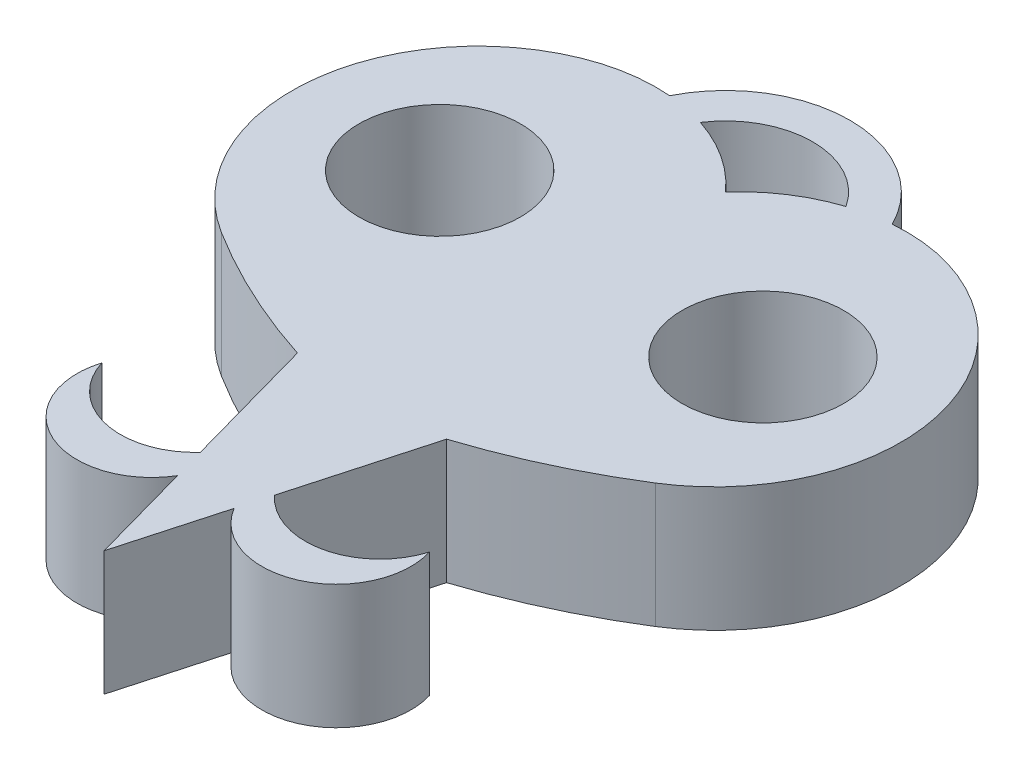
ISO-10303-21;
HEADER;
FILE_DESCRIPTION(('STEP AP214'),'2;1');
FILE_NAME('part.step','',(''),(''),'','','');
FILE_SCHEMA(('AUTOMOTIVE_DESIGN { 1 0 10303 214 1 1 1 1 }'));
ENDSEC;
DATA;
#1=APPLICATION_CONTEXT('core data for automotive mechanical design processes');
#2=APPLICATION_PROTOCOL_DEFINITION('international standard','automotive_design',2000,#1);
#3=PRODUCT_CONTEXT('',#1,'mechanical');
#4=PRODUCT('Part','Part','',(#3));
#5=PRODUCT_RELATED_PRODUCT_CATEGORY('part','',(#4));
#6=PRODUCT_DEFINITION_FORMATION('','',#4);
#7=PRODUCT_DEFINITION_CONTEXT('part definition',#1,'design');
#8=PRODUCT_DEFINITION('design','',#6,#7);
#9=PRODUCT_DEFINITION_SHAPE('','',#8);
#10=(LENGTH_UNIT() NAMED_UNIT(*) SI_UNIT(.MILLI.,.METRE.));
#11=(NAMED_UNIT(*) PLANE_ANGLE_UNIT() SI_UNIT($,.RADIAN.));
#12=(NAMED_UNIT(*) SI_UNIT($,.STERADIAN.) SOLID_ANGLE_UNIT());
#13=UNCERTAINTY_MEASURE_WITH_UNIT(LENGTH_MEASURE(1.E-05),#10,'distance_accuracy_value','');
#14=(GEOMETRIC_REPRESENTATION_CONTEXT(3) GLOBAL_UNCERTAINTY_ASSIGNED_CONTEXT((#13)) GLOBAL_UNIT_ASSIGNED_CONTEXT((#10,
#11,#12)) REPRESENTATION_CONTEXT('',''));
#15=CARTESIAN_POINT('',(0.,0.,0.));
#16=DIRECTION('',(0.,0.,1.));
#17=DIRECTION('',(1.,0.,0.));
#18=AXIS2_PLACEMENT_3D('',#15,#16,#17);
#19=CARTESIAN_POINT('',(-14.0872282582487,12.,-23.4771888934564));
#20=DIRECTION('',(0.,-1.,0.));
#21=DIRECTION('',(0.,0.,-1.));
#22=AXIS2_PLACEMENT_3D('',#19,#20,#21);
#23=CYLINDRICAL_SURFACE('',#22,18.9);
#24=CARTESIAN_POINT('',(-14.0872282582487,-2.,-23.4771888934564));
#25=DIRECTION('',(0.,1.,0.));
#26=DIRECTION('',(0.,0.,1.));
#27=AXIS2_PLACEMENT_3D('',#24,#25,#26);
#28=CIRCLE('',#27,18.9);
#29=CARTESIAN_POINT('',(0.,-2.,-36.0771888934564));
#30=VERTEX_POINT('',#29);
#31=CARTESIAN_POINT('',(-8.20370039289351,-2.,-41.4380936551211));
#32=VERTEX_POINT('',#31);
#33=EDGE_CURVE('E183',#30,#32,#28,.T.);
#34=ORIENTED_EDGE('',*,*,#33,.T.);
#35=DIRECTION('',(0.,-1.,0.));
#36=VECTOR('',#35,1.);
#37=CARTESIAN_POINT('',(-8.20370039289351,12.,-41.4380936551211));
#38=LINE('',#37,#36);
#39=CARTESIAN_POINT('',(-8.20370039289351,12.,-41.4380936551211));
#40=VERTEX_POINT('',#39);
#41=EDGE_CURVE('E11',#40,#32,#38,.T.);
#42=ORIENTED_EDGE('',*,*,#41,.F.);
#43=CARTESIAN_POINT('',(-14.0872282582487,12.,-23.4771888934564));
#44=DIRECTION('',(0.,1.,0.));
#45=DIRECTION('',(0.,0.,1.));
#46=AXIS2_PLACEMENT_3D('',#43,#44,#45);
#47=CIRCLE('',#46,18.9);
#48=CARTESIAN_POINT('',(0.,12.,-36.0771888934564));
#49=VERTEX_POINT('',#48);
#50=EDGE_CURVE('E176',#49,#40,#47,.T.);
#51=ORIENTED_EDGE('',*,*,#50,.F.);
#52=DIRECTION('',(0.,-1.,0.));
#53=VECTOR('',#52,1.);
#54=CARTESIAN_POINT('',(0.,12.,-36.0771888934564));
#55=LINE('',#54,#53);
#56=EDGE_CURVE('E57',#49,#30,#55,.T.);
#57=ORIENTED_EDGE('',*,*,#56,.T.);
#58=EDGE_LOOP('',(#34,#42,#51,#57));
#59=FACE_BOUND('',#58,.T.);
#60=ADVANCED_FACE('F38',(#59),#23,.T.);
#61=CARTESIAN_POINT('',(0.,12.,-36.0771888934564));
#62=DIRECTION('',(0.,-1.,0.));
#63=DIRECTION('',(0.,0.,-1.));
#64=AXIS2_PLACEMENT_3D('',#61,#62,#63);
#65=CYLINDRICAL_SURFACE('',#64,9.8);
#66=CARTESIAN_POINT('',(0.,-2.,-36.0771888934564));
#67=DIRECTION('',(0.,1.,0.));
#68=DIRECTION('',(0.,0.,1.));
#69=AXIS2_PLACEMENT_3D('',#66,#67,#68);
#70=CIRCLE('',#69,9.8);
#71=CARTESIAN_POINT('',(8.20370039289349,-2.,-41.4380936551211));
#72=VERTEX_POINT('',#71);
#73=EDGE_CURVE('E186',#32,#72,#70,.F.);
#74=ORIENTED_EDGE('',*,*,#73,.T.);
#75=DIRECTION('',(0.,-1.,0.));
#76=VECTOR('',#75,1.);
#77=CARTESIAN_POINT('',(8.20370039289349,12.,-41.4380936551211));
#78=LINE('',#77,#76);
#79=CARTESIAN_POINT('',(8.20370039289349,12.,-41.4380936551211));
#80=VERTEX_POINT('',#79);
#81=EDGE_CURVE('E48',#80,#72,#78,.T.);
#82=ORIENTED_EDGE('',*,*,#81,.F.);
#83=CARTESIAN_POINT('',(0.,12.,-36.0771888934564));
#84=DIRECTION('',(0.,1.,0.));
#85=DIRECTION('',(0.,0.,1.));
#86=AXIS2_PLACEMENT_3D('',#83,#84,#85);
#87=CIRCLE('',#86,9.8);
#88=EDGE_CURVE('E169',#40,#80,#87,.F.);
#89=ORIENTED_EDGE('',*,*,#88,.F.);
#90=ORIENTED_EDGE('',*,*,#41,.T.);
#91=EDGE_LOOP('',(#74,#82,#89,#90));
#92=FACE_BOUND('',#91,.T.);
#93=ADVANCED_FACE('F171',(#92),#65,.F.);
#94=CARTESIAN_POINT('',(-7.23450439594268,12.,7.93690496036144));
#95=DIRECTION('',(-0.963362899767975,0.,0.268201273954168));
#96=DIRECTION('',(0.268201273954168,0.,0.963362899767975));
#97=AXIS2_PLACEMENT_3D('',#94,#95,#96);
#98=PLANE('',#97);
#99=DIRECTION('',(-0.268201273954168,0.,-0.963362899767975));
#100=VECTOR('',#99,1.);
#101=CARTESIAN_POINT('',(-7.23450439594268,-2.,7.93690496036144));
#102=LINE('',#101,#100);
#103=CARTESIAN_POINT('',(-4.18138548338647,-2.,18.9035250870027));
#104=VERTEX_POINT('',#103);
#105=CARTESIAN_POINT('',(-8.4,-2.,3.75051461165877));
#106=VERTEX_POINT('',#105);
#107=EDGE_CURVE('E232',#104,#106,#102,.T.);
#108=ORIENTED_EDGE('',*,*,#107,.F.);
#109=DIRECTION('',(0.,-1.,0.));
#110=VECTOR('',#109,1.);
#111=CARTESIAN_POINT('',(-4.18138548338647,12.,18.9035250870027));
#112=LINE('',#111,#110);
#113=CARTESIAN_POINT('',(-4.18138548338647,12.,18.9035250870027));
#114=VERTEX_POINT('',#113);
#115=EDGE_CURVE('E42',#114,#104,#112,.T.);
#116=ORIENTED_EDGE('',*,*,#115,.F.);
#117=DIRECTION('',(-0.268201273954168,0.,-0.963362899767975));
#118=VECTOR('',#117,1.);
#119=CARTESIAN_POINT('',(-7.23450439594268,12.,7.93690496036144));
#120=LINE('',#119,#118);
#121=CARTESIAN_POINT('',(-8.4,12.,3.75051461165877));
#122=VERTEX_POINT('',#121);
#123=EDGE_CURVE('E271',#114,#122,#120,.T.);
#124=ORIENTED_EDGE('',*,*,#123,.T.);
#125=DIRECTION('',(0.,-1.,0.));
#126=VECTOR('',#125,1.);
#127=CARTESIAN_POINT('',(-8.4,12.,3.75051461165877));
#128=LINE('',#127,#126);
#129=EDGE_CURVE('E238',#122,#106,#128,.T.);
#130=ORIENTED_EDGE('',*,*,#129,.T.);
#131=EDGE_LOOP('',(#108,#116,#124,#130));
#132=FACE_BOUND('',#131,.T.);
#133=ADVANCED_FACE('F355',(#132),#98,.T.);
#134=CARTESIAN_POINT('',(-10.4147681982743,12.,13.2728111065436));
#135=DIRECTION('',(0.,-1.,0.));
#136=DIRECTION('',(0.,0.,-1.));
#137=AXIS2_PLACEMENT_3D('',#134,#135,#136);
#138=CYLINDRICAL_SURFACE('',#137,8.4);
#139=CARTESIAN_POINT('',(-10.4147681982743,-2.,13.2728111065436));
#140=DIRECTION('',(0.,1.,0.));
#141=DIRECTION('',(0.,0.,1.));
#142=AXIS2_PLACEMENT_3D('',#139,#140,#141);
#143=CIRCLE('',#142,8.4);
#144=CARTESIAN_POINT('',(-18.4495363965486,-2.,15.7228111065436));
#145=VERTEX_POINT('',#144);
#146=EDGE_CURVE('E229',#104,#145,#143,.F.);
#147=ORIENTED_EDGE('',*,*,#146,.T.);
#148=DIRECTION('',(0.,-1.,0.));
#149=VECTOR('',#148,1.);
#150=CARTESIAN_POINT('',(-18.4495363965486,12.,15.7228111065436));
#151=LINE('',#150,#149);
#152=CARTESIAN_POINT('',(-18.4495363965486,12.,15.7228111065436));
#153=VERTEX_POINT('',#152);
#154=EDGE_CURVE('E293',#153,#145,#151,.T.);
#155=ORIENTED_EDGE('',*,*,#154,.F.);
#156=CARTESIAN_POINT('',(-10.4147681982743,12.,13.2728111065436));
#157=DIRECTION('',(0.,1.,0.));
#158=DIRECTION('',(0.,0.,1.));
#159=AXIS2_PLACEMENT_3D('',#156,#157,#158);
#160=CIRCLE('',#159,8.4);
#161=EDGE_CURVE('E269',#114,#153,#160,.F.);
#162=ORIENTED_EDGE('',*,*,#161,.F.);
#163=ORIENTED_EDGE('',*,*,#115,.T.);
#164=EDGE_LOOP('',(#147,#155,#162,#163));
#165=FACE_BOUND('',#164,.T.);
#166=ADVANCED_FACE('F40',(#165),#138,.F.);
#167=CARTESIAN_POINT('',(-10.4147681982743,12.,18.1728111065435));
#168=DIRECTION('',(0.,-1.,0.));
#169=DIRECTION('',(0.,0.,-1.));
#170=AXIS2_PLACEMENT_3D('',#167,#168,#169);
#171=CYLINDRICAL_SURFACE('',#170,8.4);
#172=CARTESIAN_POINT('',(-10.4147681982743,-2.,18.1728111065435));
#173=DIRECTION('',(0.,1.,0.));
#174=DIRECTION('',(0.,0.,1.));
#175=AXIS2_PLACEMENT_3D('',#172,#173,#174);
#176=CIRCLE('',#175,8.4);
#177=CARTESIAN_POINT('',(-3.19123854098293,-2.,22.460073553634));
#178=VERTEX_POINT('',#177);
#179=EDGE_CURVE('E226',#178,#145,#176,.F.);
#180=ORIENTED_EDGE('',*,*,#179,.F.);
#181=DIRECTION('',(0.,-1.,0.));
#182=VECTOR('',#181,1.);
#183=CARTESIAN_POINT('',(-3.19123854098293,12.,22.460073553634));
#184=LINE('',#183,#182);
#185=CARTESIAN_POINT('',(-3.19123854098293,12.,22.460073553634));
#186=VERTEX_POINT('',#185);
#187=EDGE_CURVE('E283',#186,#178,#184,.T.);
#188=ORIENTED_EDGE('',*,*,#187,.F.);
#189=CARTESIAN_POINT('',(-10.4147681982743,12.,18.1728111065435));
#190=DIRECTION('',(0.,1.,0.));
#191=DIRECTION('',(0.,0.,1.));
#192=AXIS2_PLACEMENT_3D('',#189,#190,#191);
#193=CIRCLE('',#192,8.4);
#194=EDGE_CURVE('E266',#186,#153,#193,.F.);
#195=ORIENTED_EDGE('',*,*,#194,.T.);
#196=ORIENTED_EDGE('',*,*,#154,.T.);
#197=EDGE_LOOP('',(#180,#188,#195,#196));
#198=FACE_BOUND('',#197,.T.);
#199=ADVANCED_FACE('F292',(#198),#171,.T.);
#200=CARTESIAN_POINT('',(0.,-2.,33.9228111065436));
#201=VERTEX_POINT('',#200);
#202=EDGE_CURVE('E225',#201,#178,#102,.T.);
#203=ORIENTED_EDGE('',*,*,#202,.F.);
#204=DIRECTION('',(0.,-1.,0.));
#205=VECTOR('',#204,1.);
#206=CARTESIAN_POINT('',(0.,12.,33.9228111065436));
#207=LINE('',#206,#205);
#208=CARTESIAN_POINT('',(0.,12.,33.9228111065436));
#209=VERTEX_POINT('',#208);
#210=EDGE_CURVE('E285',#209,#201,#207,.T.);
#211=ORIENTED_EDGE('',*,*,#210,.F.);
#212=EDGE_CURVE('E265',#209,#186,#120,.T.);
#213=ORIENTED_EDGE('',*,*,#212,.T.);
#214=ORIENTED_EDGE('',*,*,#187,.T.);
#215=EDGE_LOOP('',(#203,#211,#213,#214));
#216=FACE_BOUND('',#215,.T.);
#217=ADVANCED_FACE('F282',(#216),#98,.T.);
#218=CARTESIAN_POINT('',(7.23450439594267,12.,7.93690496036144));
#219=DIRECTION('',(-0.963362899767975,0.,-0.268201273954168));
#220=DIRECTION('',(-0.268201273954168,0.,0.963362899767975));
#221=AXIS2_PLACEMENT_3D('',#218,#219,#220);
#222=PLANE('',#221);
#223=DIRECTION('',(0.268201273954168,0.,-0.963362899767975));
#224=VECTOR('',#223,1.);
#225=CARTESIAN_POINT('',(7.23450439594267,-2.,7.93690496036144));
#226=LINE('',#225,#224);
#227=CARTESIAN_POINT('',(3.19123854098292,-2.,22.460073553634));
#228=VERTEX_POINT('',#227);
#229=EDGE_CURVE('E223',#201,#228,#226,.T.);
#230=ORIENTED_EDGE('',*,*,#229,.T.);
#231=DIRECTION('',(0.,-1.,0.));
#232=VECTOR('',#231,1.);
#233=CARTESIAN_POINT('',(3.19123854098292,12.,22.460073553634));
#234=LINE('',#233,#232);
#235=CARTESIAN_POINT('',(3.19123854098292,12.,22.460073553634));
#236=VERTEX_POINT('',#235);
#237=EDGE_CURVE('E296',#236,#228,#234,.T.);
#238=ORIENTED_EDGE('',*,*,#237,.F.);
#239=DIRECTION('',(0.268201273954168,0.,-0.963362899767975));
#240=VECTOR('',#239,1.);
#241=CARTESIAN_POINT('',(7.23450439594267,12.,7.93690496036144));
#242=LINE('',#241,#240);
#243=EDGE_CURVE('E263',#209,#236,#242,.T.);
#244=ORIENTED_EDGE('',*,*,#243,.F.);
#245=ORIENTED_EDGE('',*,*,#210,.T.);
#246=EDGE_LOOP('',(#230,#238,#244,#245));
#247=FACE_BOUND('',#246,.T.);
#248=ADVANCED_FACE('F380',(#247),#222,.F.);
#249=CARTESIAN_POINT('',(10.4147681982743,12.,18.1728111065436));
#250=DIRECTION('',(0.,-1.,0.));
#251=DIRECTION('',(0.,0.,-1.));
#252=AXIS2_PLACEMENT_3D('',#249,#250,#251);
#253=CYLINDRICAL_SURFACE('',#252,8.4);
#254=CARTESIAN_POINT('',(10.4147681982743,-2.,18.1728111065436));
#255=DIRECTION('',(0.,1.,0.));
#256=DIRECTION('',(0.,0.,1.));
#257=AXIS2_PLACEMENT_3D('',#254,#255,#256);
#258=CIRCLE('',#257,8.4);
#259=CARTESIAN_POINT('',(18.4495363965486,-2.,15.7228111065436));
#260=VERTEX_POINT('',#259);
#261=EDGE_CURVE('E220',#228,#260,#258,.T.);
#262=ORIENTED_EDGE('',*,*,#261,.T.);
#263=DIRECTION('',(0.,-1.,0.));
#264=VECTOR('',#263,1.);
#265=CARTESIAN_POINT('',(18.4495363965486,12.,15.7228111065436));
#266=LINE('',#265,#264);
#267=CARTESIAN_POINT('',(18.4495363965486,12.,15.7228111065436));
#268=VERTEX_POINT('',#267);
#269=EDGE_CURVE('E301',#268,#260,#266,.T.);
#270=ORIENTED_EDGE('',*,*,#269,.F.);
#271=CARTESIAN_POINT('',(10.4147681982743,12.,18.1728111065436));
#272=DIRECTION('',(0.,1.,0.));
#273=DIRECTION('',(0.,0.,1.));
#274=AXIS2_PLACEMENT_3D('',#271,#272,#273);
#275=CIRCLE('',#274,8.4);
#276=EDGE_CURVE('E261',#236,#268,#275,.T.);
#277=ORIENTED_EDGE('',*,*,#276,.F.);
#278=ORIENTED_EDGE('',*,*,#237,.T.);
#279=EDGE_LOOP('',(#262,#270,#277,#278));
#280=FACE_BOUND('',#279,.T.);
#281=ADVANCED_FACE('F383',(#280),#253,.T.);
#282=CARTESIAN_POINT('',(10.4147681982743,12.,13.2728111065436));
#283=DIRECTION('',(0.,-1.,0.));
#284=DIRECTION('',(0.,0.,-1.));
#285=AXIS2_PLACEMENT_3D('',#282,#283,#284);
#286=CYLINDRICAL_SURFACE('',#285,8.4);
#287=CARTESIAN_POINT('',(10.4147681982743,-2.,13.2728111065436));
#288=DIRECTION('',(0.,1.,0.));
#289=DIRECTION('',(0.,0.,1.));
#290=AXIS2_PLACEMENT_3D('',#287,#288,#289);
#291=CIRCLE('',#290,8.4);
#292=CARTESIAN_POINT('',(4.18138548338646,-2.,18.9035250870027));
#293=VERTEX_POINT('',#292);
#294=EDGE_CURVE('E217',#293,#260,#291,.T.);
#295=ORIENTED_EDGE('',*,*,#294,.F.);
#296=DIRECTION('',(0.,-1.,0.));
#297=VECTOR('',#296,1.);
#298=CARTESIAN_POINT('',(4.18138548338646,12.,18.9035250870027));
#299=LINE('',#298,#297);
#300=CARTESIAN_POINT('',(4.18138548338646,12.,18.9035250870027));
#301=VERTEX_POINT('',#300);
#302=EDGE_CURVE('E303',#301,#293,#299,.T.);
#303=ORIENTED_EDGE('',*,*,#302,.F.);
#304=CARTESIAN_POINT('',(10.4147681982743,12.,13.2728111065436));
#305=DIRECTION('',(0.,1.,0.));
#306=DIRECTION('',(0.,0.,1.));
#307=AXIS2_PLACEMENT_3D('',#304,#305,#306);
#308=CIRCLE('',#307,8.4);
#309=EDGE_CURVE('E258',#301,#268,#308,.T.);
#310=ORIENTED_EDGE('',*,*,#309,.T.);
#311=ORIENTED_EDGE('',*,*,#269,.T.);
#312=EDGE_LOOP('',(#295,#303,#310,#311));
#313=FACE_BOUND('',#312,.T.);
#314=ADVANCED_FACE('F378',(#313),#286,.F.);
#315=CARTESIAN_POINT('',(8.4,-2.,3.75051461165877));
#316=VERTEX_POINT('',#315);
#317=EDGE_CURVE('E216',#293,#316,#226,.T.);
#318=ORIENTED_EDGE('',*,*,#317,.T.);
#319=DIRECTION('',(0.,-1.,0.));
#320=VECTOR('',#319,1.);
#321=CARTESIAN_POINT('',(8.4,12.,3.75051461165877));
#322=LINE('',#321,#320);
#323=CARTESIAN_POINT('',(8.4,12.,3.75051461165877));
#324=VERTEX_POINT('',#323);
#325=EDGE_CURVE('E305',#324,#316,#322,.T.);
#326=ORIENTED_EDGE('',*,*,#325,.F.);
#327=EDGE_CURVE('E257',#301,#324,#242,.T.);
#328=ORIENTED_EDGE('',*,*,#327,.F.);
#329=ORIENTED_EDGE('',*,*,#302,.T.);
#330=EDGE_LOOP('',(#318,#326,#328,#329));
#331=FACE_BOUND('',#330,.T.);
#332=ADVANCED_FACE('F374',(#331),#222,.F.);
#333=CARTESIAN_POINT('',(-13.8189820857669,12.,-64.8404967168846));
#334=DIRECTION('',(0.,-1.,0.));
#335=DIRECTION('',(0.,0.,-1.));
#336=AXIS2_PLACEMENT_3D('',#333,#334,#335);
#337=CYLINDRICAL_SURFACE('',#336,72.1);
#338=CARTESIAN_POINT('',(-13.8189820857669,-2.,-64.8404967168846));
#339=DIRECTION('',(0.,1.,0.));
#340=DIRECTION('',(0.,0.,1.));
#341=AXIS2_PLACEMENT_3D('',#338,#339,#340);
#342=CIRCLE('',#341,72.1);
#343=CARTESIAN_POINT('',(24.4447871585343,-2.,-3.73162695791373));
#344=VERTEX_POINT('',#343);
#345=EDGE_CURVE('E213',#316,#344,#342,.T.);
#346=ORIENTED_EDGE('',*,*,#345,.T.);
#347=DIRECTION('',(0.,-1.,0.));
#348=VECTOR('',#347,1.);
#349=CARTESIAN_POINT('',(24.4447871585343,12.,-3.73162695791373));
#350=LINE('',#349,#348);
#351=CARTESIAN_POINT('',(24.4447871585343,12.,-3.73162695791373));
#352=VERTEX_POINT('',#351);
#353=EDGE_CURVE('E308',#352,#344,#350,.T.);
#354=ORIENTED_EDGE('',*,*,#353,.F.);
#355=CARTESIAN_POINT('',(-13.8189820857669,12.,-64.8404967168846));
#356=DIRECTION('',(0.,1.,0.));
#357=DIRECTION('',(0.,0.,1.));
#358=AXIS2_PLACEMENT_3D('',#355,#356,#357);
#359=CIRCLE('',#358,72.1);
#360=EDGE_CURVE('E255',#324,#352,#359,.T.);
#361=ORIENTED_EDGE('',*,*,#360,.F.);
#362=ORIENTED_EDGE('',*,*,#325,.T.);
#363=EDGE_LOOP('',(#346,#354,#361,#362));
#364=FACE_BOUND('',#363,.T.);
#365=ADVANCED_FACE('F370',(#364),#337,.T.);
#366=CARTESIAN_POINT('',(13.3,12.,-21.5303268877111));
#367=DIRECTION('',(0.,-1.,0.));
#368=DIRECTION('',(0.,0.,-1.));
#369=AXIS2_PLACEMENT_3D('',#366,#367,#368);
#370=CYLINDRICAL_SURFACE('',#369,21.);
#371=CARTESIAN_POINT('',(13.3,-2.,-21.5303268877111));
#372=DIRECTION('',(0.,1.,0.));
#373=DIRECTION('',(0.,0.,1.));
#374=AXIS2_PLACEMENT_3D('',#371,#372,#373);
#375=CIRCLE('',#374,21.);
#376=CARTESIAN_POINT('',(21.1722825824867,-2.,-40.9989469451645));
#377=VERTEX_POINT('',#376);
#378=EDGE_CURVE('E208',#377,#344,#375,.F.);
#379=ORIENTED_EDGE('',*,*,#378,.F.);
#380=DIRECTION('',(0.,-1.,0.));
#381=VECTOR('',#380,1.);
#382=CARTESIAN_POINT('',(21.1722825824867,12.,-40.9989469451645));
#383=LINE('',#382,#381);
#384=CARTESIAN_POINT('',(21.1722825824867,12.,-40.9989469451645));
#385=VERTEX_POINT('',#384);
#386=EDGE_CURVE('E310',#385,#377,#383,.T.);
#387=ORIENTED_EDGE('',*,*,#386,.F.);
#388=CARTESIAN_POINT('',(13.3,12.,-21.5303268877111));
#389=DIRECTION('',(0.,1.,0.));
#390=DIRECTION('',(0.,0.,1.));
#391=AXIS2_PLACEMENT_3D('',#388,#389,#390);
#392=CIRCLE('',#391,21.);
#393=EDGE_CURVE('E252',#385,#352,#392,.F.);
#394=ORIENTED_EDGE('',*,*,#393,.T.);
#395=ORIENTED_EDGE('',*,*,#353,.T.);
#396=EDGE_LOOP('',(#379,#387,#394,#395));
#397=FACE_BOUND('',#396,.T.);
#398=ADVANCED_FACE('F347',(#397),#370,.T.);
#399=CARTESIAN_POINT('',(14.0872282582487,12.,-23.4771888934564));
#400=DIRECTION('',(0.,-1.,0.));
#401=DIRECTION('',(0.,0.,-1.));
#402=AXIS2_PLACEMENT_3D('',#399,#400,#401);
#403=CYLINDRICAL_SURFACE('',#402,18.9);
#404=CARTESIAN_POINT('',(14.0872282582487,-2.,-23.4771888934564));
#405=DIRECTION('',(0.,1.,0.));
#406=DIRECTION('',(0.,0.,1.));
#407=AXIS2_PLACEMENT_3D('',#404,#405,#406);
#408=CIRCLE('',#407,18.9);
#409=CARTESIAN_POINT('',(12.534394373742,-2.,-42.3132900539176));
#410=VERTEX_POINT('',#409);
#411=EDGE_CURVE('E204',#410,#377,#408,.F.);
#412=ORIENTED_EDGE('',*,*,#411,.F.);
#413=DIRECTION('',(0.,-1.,0.));
#414=VECTOR('',#413,1.);
#415=CARTESIAN_POINT('',(12.534394373742,12.,-42.3132900539176));
#416=LINE('',#415,#414);
#417=CARTESIAN_POINT('',(12.534394373742,12.,-42.3132900539176));
#418=VERTEX_POINT('',#417);
#419=EDGE_CURVE('E312',#418,#410,#416,.T.);
#420=ORIENTED_EDGE('',*,*,#419,.F.);
#421=CARTESIAN_POINT('',(14.0872282582487,12.,-23.4771888934564));
#422=DIRECTION('',(0.,1.,0.));
#423=DIRECTION('',(0.,0.,1.));
#424=AXIS2_PLACEMENT_3D('',#421,#422,#423);
#425=CIRCLE('',#424,18.9);
#426=EDGE_CURVE('E249',#418,#385,#425,.F.);
#427=ORIENTED_EDGE('',*,*,#426,.T.);
#428=ORIENTED_EDGE('',*,*,#386,.T.);
#429=EDGE_LOOP('',(#412,#420,#427,#428));
#430=FACE_BOUND('',#429,.T.);
#431=ADVANCED_FACE('F333',(#430),#403,.T.);
#432=CARTESIAN_POINT('',(0.,12.,-36.0771888934564));
#433=DIRECTION('',(0.,-1.,0.));
#434=DIRECTION('',(0.,0.,-1.));
#435=AXIS2_PLACEMENT_3D('',#432,#433,#434);
#436=CYLINDRICAL_SURFACE('',#435,14.);
#437=CARTESIAN_POINT('',(0.,-2.,-36.0771888934564));
#438=DIRECTION('',(0.,1.,0.));
#439=DIRECTION('',(0.,0.,1.));
#440=AXIS2_PLACEMENT_3D('',#437,#438,#439);
#441=CIRCLE('',#440,14.);
#442=CARTESIAN_POINT('',(-12.534394373742,-2.,-42.3132900539176));
#443=VERTEX_POINT('',#442);
#444=EDGE_CURVE('E197',#443,#410,#441,.F.);
#445=ORIENTED_EDGE('',*,*,#444,.F.);
#446=DIRECTION('',(0.,-1.,0.));
#447=VECTOR('',#446,1.);
#448=CARTESIAN_POINT('',(-12.534394373742,12.,-42.3132900539176));
#449=LINE('',#448,#447);
#450=CARTESIAN_POINT('',(-12.534394373742,12.,-42.3132900539176));
#451=VERTEX_POINT('',#450);
#452=EDGE_CURVE('E314',#451,#443,#449,.T.);
#453=ORIENTED_EDGE('',*,*,#452,.F.);
#454=CARTESIAN_POINT('',(0.,12.,-36.0771888934564));
#455=DIRECTION('',(0.,1.,0.));
#456=DIRECTION('',(0.,0.,1.));
#457=AXIS2_PLACEMENT_3D('',#454,#455,#456);
#458=CIRCLE('',#457,14.);
#459=EDGE_CURVE('E246',#451,#418,#458,.F.);
#460=ORIENTED_EDGE('',*,*,#459,.T.);
#461=ORIENTED_EDGE('',*,*,#419,.T.);
#462=EDGE_LOOP('',(#445,#453,#460,#461));
#463=FACE_BOUND('',#462,.T.);
#464=ADVANCED_FACE('F346',(#463),#436,.T.);
#465=CARTESIAN_POINT('',(-21.1722825824867,-2.,-40.9989469451645));
#466=VERTEX_POINT('',#465);
#467=EDGE_CURVE('E189',#443,#466,#28,.T.);
#468=ORIENTED_EDGE('',*,*,#467,.T.);
#469=DIRECTION('',(0.,-1.,0.));
#470=VECTOR('',#469,1.);
#471=CARTESIAN_POINT('',(-21.1722825824867,12.,-40.9989469451645));
#472=LINE('',#471,#470);
#473=CARTESIAN_POINT('',(-21.1722825824867,12.,-40.9989469451645));
#474=VERTEX_POINT('',#473);
#475=EDGE_CURVE('E316',#474,#466,#472,.T.);
#476=ORIENTED_EDGE('',*,*,#475,.F.);
#477=EDGE_CURVE('E182',#451,#474,#47,.T.);
#478=ORIENTED_EDGE('',*,*,#477,.F.);
#479=ORIENTED_EDGE('',*,*,#452,.T.);
#480=EDGE_LOOP('',(#468,#476,#478,#479));
#481=FACE_BOUND('',#480,.T.);
#482=ADVANCED_FACE('F351',(#481),#23,.T.);
#483=CARTESIAN_POINT('',(-13.3,12.,-21.5303268877111));
#484=DIRECTION('',(0.,-1.,0.));
#485=DIRECTION('',(0.,0.,-1.));
#486=AXIS2_PLACEMENT_3D('',#483,#484,#485);
#487=CYLINDRICAL_SURFACE('',#486,21.);
#488=CARTESIAN_POINT('',(-13.3,-2.,-21.5303268877111));
#489=DIRECTION('',(0.,1.,0.));
#490=DIRECTION('',(0.,0.,1.));
#491=AXIS2_PLACEMENT_3D('',#488,#489,#490);
#492=CIRCLE('',#491,21.);
#493=CARTESIAN_POINT('',(-24.4447871585343,-2.,-3.73162695791372));
#494=VERTEX_POINT('',#493);
#495=EDGE_CURVE('E193',#466,#494,#492,.T.);
#496=ORIENTED_EDGE('',*,*,#495,.T.);
#497=DIRECTION('',(0.,-1.,0.));
#498=VECTOR('',#497,1.);
#499=CARTESIAN_POINT('',(-24.4447871585343,12.,-3.73162695791372));
#500=LINE('',#499,#498);
#501=CARTESIAN_POINT('',(-24.4447871585343,12.,-3.73162695791372));
#502=VERTEX_POINT('',#501);
#503=EDGE_CURVE('E318',#502,#494,#500,.T.);
#504=ORIENTED_EDGE('',*,*,#503,.F.);
#505=CARTESIAN_POINT('',(-13.3,12.,-21.5303268877111));
#506=DIRECTION('',(0.,1.,0.));
#507=DIRECTION('',(0.,0.,1.));
#508=AXIS2_PLACEMENT_3D('',#505,#506,#507);
#509=CIRCLE('',#508,21.);
#510=EDGE_CURVE('E244',#474,#502,#509,.T.);
#511=ORIENTED_EDGE('',*,*,#510,.F.);
#512=ORIENTED_EDGE('',*,*,#475,.T.);
#513=EDGE_LOOP('',(#496,#504,#511,#512));
#514=FACE_BOUND('',#513,.T.);
#515=ADVANCED_FACE('F341',(#514),#487,.T.);
#516=CARTESIAN_POINT('',(-18.2,12.,-22.0771888934564));
#517=DIRECTION('',(0.,-1.,0.));
#518=DIRECTION('',(0.,0.,-1.));
#519=AXIS2_PLACEMENT_3D('',#516,#517,#518);
#520=CYLINDRICAL_SURFACE('',#519,9.1);
#521=CARTESIAN_POINT('',(-18.2,12.,-22.0771888934564));
#522=DIRECTION('',(0.,1.,0.));
#523=DIRECTION('',(0.,0.,1.));
#524=AXIS2_PLACEMENT_3D('',#521,#522,#523);
#525=CIRCLE('',#524,9.1);
#526=CARTESIAN_POINT('',(-18.2,12.,-12.9771888934564));
#527=VERTEX_POINT('',#526);
#528=EDGE_CURVE('E239',#527,#527,#525,.F.);
#529=ORIENTED_EDGE('',*,*,#528,.F.);
#530=EDGE_LOOP('',(#529));
#531=FACE_BOUND('',#530,.T.);
#532=CARTESIAN_POINT('',(-18.2,-2.,-22.0771888934564));
#533=DIRECTION('',(0.,1.,0.));
#534=DIRECTION('',(0.,0.,1.));
#535=AXIS2_PLACEMENT_3D('',#532,#533,#534);
#536=CIRCLE('',#535,9.1);
#537=CARTESIAN_POINT('',(-18.2,-2.,-12.9771888934564));
#538=VERTEX_POINT('',#537);
#539=EDGE_CURVE('E276',#538,#538,#536,.F.);
#540=ORIENTED_EDGE('',*,*,#539,.T.);
#541=EDGE_LOOP('',(#540));
#542=FACE_BOUND('',#541,.T.);
#543=ADVANCED_FACE('F331',(#531,#542),#520,.F.);
#544=EDGE_CURVE('E190',#30,#72,#408,.F.);
#545=ORIENTED_EDGE('',*,*,#544,.F.);
#546=ORIENTED_EDGE('',*,*,#56,.F.);
#547=EDGE_CURVE('E175',#49,#80,#425,.F.);
#548=ORIENTED_EDGE('',*,*,#547,.T.);
#549=ORIENTED_EDGE('',*,*,#81,.T.);
#550=EDGE_LOOP('',(#545,#546,#548,#549));
#551=FACE_BOUND('',#550,.T.);
#552=ADVANCED_FACE('F328',(#551),#403,.T.);
#553=CARTESIAN_POINT('',(13.8189820857669,12.,-64.8404967168846));
#554=DIRECTION('',(0.,-1.,0.));
#555=DIRECTION('',(0.,0.,-1.));
#556=AXIS2_PLACEMENT_3D('',#553,#554,#555);
#557=CYLINDRICAL_SURFACE('',#556,72.1);
#558=CARTESIAN_POINT('',(13.8189820857669,-2.,-64.8404967168846));
#559=DIRECTION('',(0.,1.,0.));
#560=DIRECTION('',(0.,0.,1.));
#561=AXIS2_PLACEMENT_3D('',#558,#559,#560);
#562=CIRCLE('',#561,72.1);
#563=EDGE_CURVE('E187',#106,#494,#562,.F.);
#564=ORIENTED_EDGE('',*,*,#563,.F.);
#565=ORIENTED_EDGE('',*,*,#129,.F.);
#566=CARTESIAN_POINT('',(13.8189820857669,12.,-64.8404967168846));
#567=DIRECTION('',(0.,1.,0.));
#568=DIRECTION('',(0.,0.,1.));
#569=AXIS2_PLACEMENT_3D('',#566,#567,#568);
#570=CIRCLE('',#569,72.1);
#571=EDGE_CURVE('E180',#122,#502,#570,.F.);
#572=ORIENTED_EDGE('',*,*,#571,.T.);
#573=ORIENTED_EDGE('',*,*,#503,.T.);
#574=EDGE_LOOP('',(#564,#565,#572,#573));
#575=FACE_BOUND('',#574,.T.);
#576=ADVANCED_FACE('F330',(#575),#557,.T.);
#577=CARTESIAN_POINT('',(18.2,12.,-22.0771888934564));
#578=DIRECTION('',(0.,-1.,0.));
#579=DIRECTION('',(0.,0.,-1.));
#580=AXIS2_PLACEMENT_3D('',#577,#578,#579);
#581=CYLINDRICAL_SURFACE('',#580,9.1);
#582=CARTESIAN_POINT('',(18.2,12.,-22.0771888934564));
#583=DIRECTION('',(0.,1.,0.));
#584=DIRECTION('',(0.,0.,1.));
#585=AXIS2_PLACEMENT_3D('',#582,#583,#584);
#586=CIRCLE('',#585,9.1);
#587=CARTESIAN_POINT('',(18.2,12.,-12.9771888934564));
#588=VERTEX_POINT('',#587);
#589=EDGE_CURVE('E235',#588,#588,#586,.T.);
#590=ORIENTED_EDGE('',*,*,#589,.T.);
#591=EDGE_LOOP('',(#590));
#592=FACE_BOUND('',#591,.T.);
#593=CARTESIAN_POINT('',(18.2,-2.,-22.0771888934564));
#594=DIRECTION('',(0.,1.,0.));
#595=DIRECTION('',(0.,0.,1.));
#596=AXIS2_PLACEMENT_3D('',#593,#594,#595);
#597=CIRCLE('',#596,9.1);
#598=CARTESIAN_POINT('',(18.2,-2.,-12.9771888934564));
#599=VERTEX_POINT('',#598);
#600=EDGE_CURVE('E272',#599,#599,#597,.T.);
#601=ORIENTED_EDGE('',*,*,#600,.F.);
#602=EDGE_LOOP('',(#601));
#603=FACE_BOUND('',#602,.T.);
#604=ADVANCED_FACE('F338',(#592,#603),#581,.F.);
#605=CARTESIAN_POINT('',(0.,12.,5.92281110654355));
#606=DIRECTION('',(0.,1.,0.));
#607=DIRECTION('',(0.,0.,1.));
#608=AXIS2_PLACEMENT_3D('',#605,#606,#607);
#609=PLANE('',#608);
#610=ORIENTED_EDGE('',*,*,#123,.F.);
#611=ORIENTED_EDGE('',*,*,#161,.T.);
#612=ORIENTED_EDGE('',*,*,#194,.F.);
#613=ORIENTED_EDGE('',*,*,#212,.F.);
#614=ORIENTED_EDGE('',*,*,#243,.T.);
#615=ORIENTED_EDGE('',*,*,#276,.T.);
#616=ORIENTED_EDGE('',*,*,#309,.F.);
#617=ORIENTED_EDGE('',*,*,#327,.T.);
#618=ORIENTED_EDGE('',*,*,#360,.T.);
#619=ORIENTED_EDGE('',*,*,#393,.F.);
#620=ORIENTED_EDGE('',*,*,#426,.F.);
#621=ORIENTED_EDGE('',*,*,#459,.F.);
#622=ORIENTED_EDGE('',*,*,#477,.T.);
#623=ORIENTED_EDGE('',*,*,#510,.T.);
#624=ORIENTED_EDGE('',*,*,#571,.F.);
#625=EDGE_LOOP('',(#610,#611,#612,#613,#614,#615,#616,#617,#618,#619,#620,#621,#622,#623,#624));
#626=FACE_BOUND('',#625,.T.);
#627=ORIENTED_EDGE('',*,*,#50,.T.);
#628=ORIENTED_EDGE('',*,*,#88,.T.);
#629=ORIENTED_EDGE('',*,*,#547,.F.);
#630=EDGE_LOOP('',(#627,#628,#629));
#631=FACE_BOUND('',#630,.T.);
#632=ORIENTED_EDGE('',*,*,#528,.T.);
#633=EDGE_LOOP('',(#632));
#634=FACE_BOUND('',#633,.T.);
#635=ORIENTED_EDGE('',*,*,#589,.F.);
#636=EDGE_LOOP('',(#635));
#637=FACE_BOUND('',#636,.T.);
#638=ADVANCED_FACE('F178',(#626,#631,#634,#637),#609,.T.);
#639=CARTESIAN_POINT('',(0.,-2.,5.92281110654355));
#640=DIRECTION('',(0.,1.,0.));
#641=DIRECTION('',(0.,0.,1.));
#642=AXIS2_PLACEMENT_3D('',#639,#640,#641);
#643=PLANE('',#642);
#644=ORIENTED_EDGE('',*,*,#107,.T.);
#645=ORIENTED_EDGE('',*,*,#563,.T.);
#646=ORIENTED_EDGE('',*,*,#495,.F.);
#647=ORIENTED_EDGE('',*,*,#467,.F.);
#648=ORIENTED_EDGE('',*,*,#444,.T.);
#649=ORIENTED_EDGE('',*,*,#411,.T.);
#650=ORIENTED_EDGE('',*,*,#378,.T.);
#651=ORIENTED_EDGE('',*,*,#345,.F.);
#652=ORIENTED_EDGE('',*,*,#317,.F.);
#653=ORIENTED_EDGE('',*,*,#294,.T.);
#654=ORIENTED_EDGE('',*,*,#261,.F.);
#655=ORIENTED_EDGE('',*,*,#229,.F.);
#656=ORIENTED_EDGE('',*,*,#202,.T.);
#657=ORIENTED_EDGE('',*,*,#179,.T.);
#658=ORIENTED_EDGE('',*,*,#146,.F.);
#659=EDGE_LOOP('',(#644,#645,#646,#647,#648,#649,#650,#651,#652,#653,#654,#655,#656,#657,#658));
#660=FACE_BOUND('',#659,.T.);
#661=ORIENTED_EDGE('',*,*,#33,.F.);
#662=ORIENTED_EDGE('',*,*,#544,.T.);
#663=ORIENTED_EDGE('',*,*,#73,.F.);
#664=EDGE_LOOP('',(#661,#662,#663));
#665=FACE_BOUND('',#664,.T.);
#666=ORIENTED_EDGE('',*,*,#539,.F.);
#667=EDGE_LOOP('',(#666));
#668=FACE_BOUND('',#667,.T.);
#669=ORIENTED_EDGE('',*,*,#600,.T.);
#670=EDGE_LOOP('',(#669));
#671=FACE_BOUND('',#670,.T.);
#672=ADVANCED_FACE('F326',(#660,#665,#668,#671),#643,.F.);
#673=CLOSED_SHELL('',(#60,#93,#133,#166,#199,#217,#248,#281,#314,#332,#365,#398,#431,#464,#482,
#515,#543,#552,#576,#604,#638,#672));
#674=MANIFOLD_SOLID_BREP('B2',#673);
#675=ADVANCED_BREP_SHAPE_REPRESENTATION('',(#18,#674),#14);
#676=SHAPE_DEFINITION_REPRESENTATION(#9,#675);
ENDSEC;
END-ISO-10303-21;
